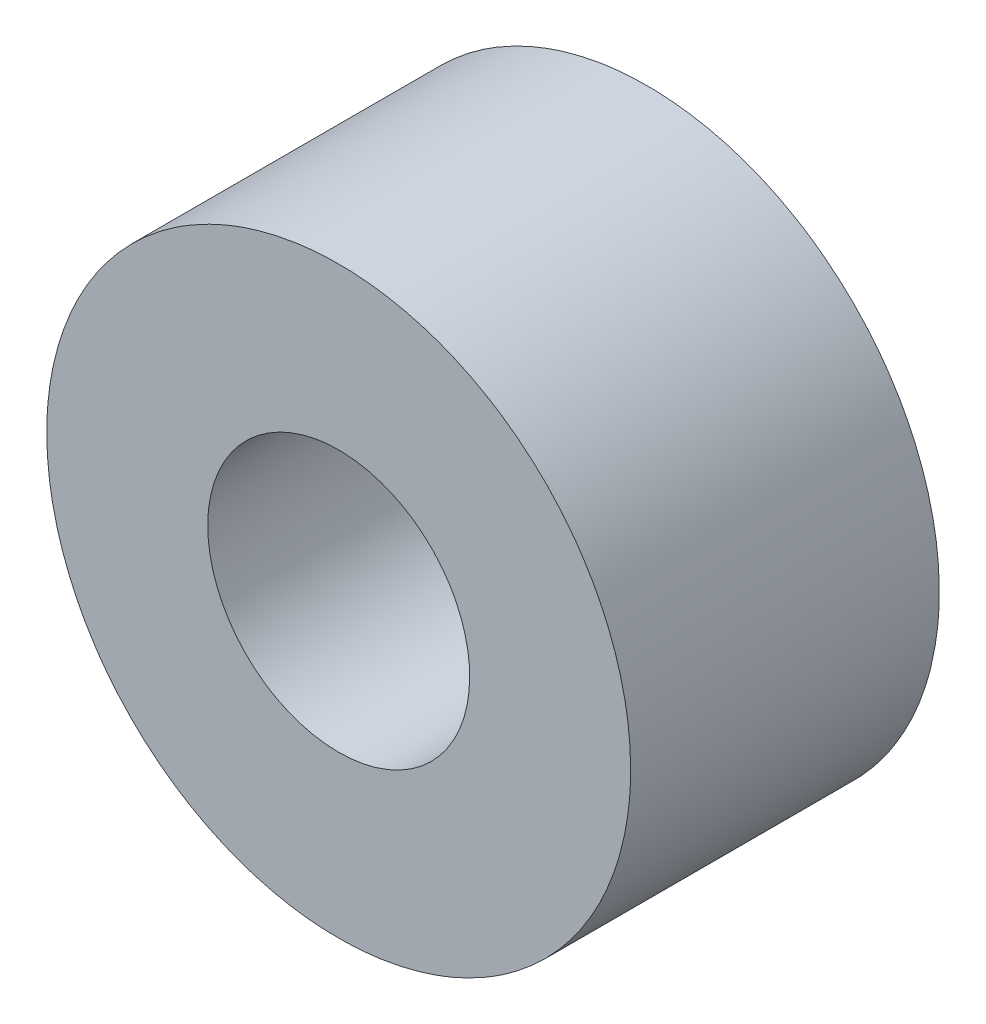
ISO-10303-21;
HEADER;
FILE_DESCRIPTION(('STEP AP214'),'2;1');
FILE_NAME('part.step','',(''),(''),'','','');
FILE_SCHEMA(('AUTOMOTIVE_DESIGN { 1 0 10303 214 1 1 1 1 }'));
ENDSEC;
DATA;
#1=APPLICATION_CONTEXT('core data for automotive mechanical design processes');
#2=APPLICATION_PROTOCOL_DEFINITION('international standard','automotive_design',2000,#1);
#3=PRODUCT_CONTEXT('',#1,'mechanical');
#4=PRODUCT('Part','Part','',(#3));
#5=PRODUCT_RELATED_PRODUCT_CATEGORY('part','',(#4));
#6=PRODUCT_DEFINITION_FORMATION('','',#4);
#7=PRODUCT_DEFINITION_CONTEXT('part definition',#1,'design');
#8=PRODUCT_DEFINITION('design','',#6,#7);
#9=PRODUCT_DEFINITION_SHAPE('','',#8);
#10=(LENGTH_UNIT() NAMED_UNIT(*) SI_UNIT(.MILLI.,.METRE.));
#11=(NAMED_UNIT(*) PLANE_ANGLE_UNIT() SI_UNIT($,.RADIAN.));
#12=(NAMED_UNIT(*) SI_UNIT($,.STERADIAN.) SOLID_ANGLE_UNIT());
#13=UNCERTAINTY_MEASURE_WITH_UNIT(LENGTH_MEASURE(1.E-05),#10,'distance_accuracy_value','');
#14=(GEOMETRIC_REPRESENTATION_CONTEXT(3) GLOBAL_UNCERTAINTY_ASSIGNED_CONTEXT((#13)) GLOBAL_UNIT_ASSIGNED_CONTEXT((#10,
#11,#12)) REPRESENTATION_CONTEXT('',''));
#15=CARTESIAN_POINT('',(0.,0.,0.));
#16=DIRECTION('',(0.,0.,1.));
#17=DIRECTION('',(1.,0.,0.));
#18=AXIS2_PLACEMENT_3D('',#15,#16,#17);
#19=CARTESIAN_POINT('',(9.715,0.,31.05));
#20=CARTESIAN_POINT('',(9.715,0.,29.2));
#21=(BOUNDED_CURVE() B_SPLINE_CURVE(1,(#19,#20),.UNSPECIFIED.,.F.,
.F.) B_SPLINE_CURVE_WITH_KNOTS((2,2),(0.,1.),
.UNSPECIFIED.) CURVE() GEOMETRIC_REPRESENTATION_ITEM() RATIONAL_B_SPLINE_CURVE((1.,1.)) REPRESENTATION_ITEM(''));
#22=CARTESIAN_POINT('',(10.5,0.,30.75));
#23=DIRECTION('',(0.,0.,-1.));
#24=AXIS1_PLACEMENT('',#22,#23);
#25=SURFACE_OF_REVOLUTION('',#21,#24);
#26=CARTESIAN_POINT('',(11.285,-2.14675006004466E-10,29.2));
#27=CARTESIAN_POINT('',(11.2849963750148,0.0440684133574314,29.2));
#28=CARTESIAN_POINT('',(11.2812754640604,0.0881768203301335,29.2));
#29=CARTESIAN_POINT('',(11.2664725207291,0.17521679726765,29.2));
#30=CARTESIAN_POINT('',(11.2553747338933,0.218145643325502,29.2));
#31=CARTESIAN_POINT('',(11.2261382734314,0.301488087333988,29.2));
#32=CARTESIAN_POINT('',(11.2080072198731,0.341904352697235,29.2));
#33=CARTESIAN_POINT('',(11.1652166658533,0.419118747931632,29.2));
#34=CARTESIAN_POINT('',(11.1405570158521,0.455916794899813,29.2));
#35=CARTESIAN_POINT('',(11.085411325476,0.524849041618551,29.2));
#36=CARTESIAN_POINT('',(11.0549256027588,0.556983495476428,29.2));
#37=CARTESIAN_POINT('',(10.9889892760106,0.615680875051215,29.2));
#38=CARTESIAN_POINT('',(10.9535382446612,0.642243320744643,29.2));
#39=CARTESIAN_POINT('',(10.8786811775078,0.689038329909469,29.2));
#40=CARTESIAN_POINT('',(10.8392752909095,0.709271132062058,29.2));
#41=CARTESIAN_POINT('',(10.757626451956,0.742833653882891,29.2));
#42=CARTESIAN_POINT('',(10.7153835299072,0.756163447278492,29.2));
#43=CARTESIAN_POINT('',(10.6292591552849,0.775541948528298,29.2));
#44=CARTESIAN_POINT('',(10.5853776939624,0.781590617498208,29.2));
#45=CARTESIAN_POINT('',(10.4972221192467,0.786235033158719,29.2));
#46=CARTESIAN_POINT('',(10.4529480058536,0.78483077984932,29.2));
#47=CARTESIAN_POINT('',(10.3652641736954,0.774609244113034,29.2));
#48=CARTESIAN_POINT('',(10.3218544503154,0.765792001274523,29.2));
#49=CARTESIAN_POINT('',(10.2371309638373,0.740994690686244,29.2));
#50=CARTESIAN_POINT('',(10.1958172231305,0.725014546432774,29.2));
#51=CARTESIAN_POINT('',(10.1164574802189,0.686344343556039,29.2));
#52=CARTESIAN_POINT('',(10.0784116013136,0.663654031894831,29.2));
#53=CARTESIAN_POINT('',(10.0066725494512,0.612209984699173,29.2));
#54=CARTESIAN_POINT('',(9.97297900198056,0.583456771432166,29.2));
#55=CARTESIAN_POINT('',(9.91089540174609,0.520700669046193,29.2));
#56=CARTESIAN_POINT('',(9.88250563818064,0.486697493848114,29.2));
#57=CARTESIAN_POINT('',(9.83183851437879,0.414406851919968,29.2));
#58=CARTESIAN_POINT('',(9.80956101414177,0.376119483347099,29.2));
#59=CARTESIAN_POINT('',(9.77172903292193,0.296310493937302,29.2));
#60=CARTESIAN_POINT('',(9.75618184953922,0.254785419760728,29.2));
#61=CARTESIAN_POINT('',(9.73231495729556,0.169782736443318,29.2));
#62=CARTESIAN_POINT('',(9.72397986741072,0.126309491560882,29.2));
#63=CARTESIAN_POINT('',(9.71644842974934,0.0550869072695784,29.2));
#64=CARTESIAN_POINT('',(9.71499773367495,0.0275512696503874,29.2));
#65=CARTESIAN_POINT('',(9.71500362499988,-0.0440684136194467,29.2));
#66=CARTESIAN_POINT('',(9.71872453596904,-0.0881768205908649,29.2));
#67=CARTESIAN_POINT('',(9.73352747932935,-0.175216797523317,29.2));
#68=CARTESIAN_POINT('',(9.7446252661795,-0.218145643577392,29.2));
#69=CARTESIAN_POINT('',(9.77386172666911,-0.301488087576055,29.2));
#70=CARTESIAN_POINT('',(9.79199278024087,-0.341904352933252,29.2));
#71=CARTESIAN_POINT('',(9.83478333428643,-0.419118748153375,29.2));
#72=CARTESIAN_POINT('',(9.85944298429988,-0.455916795113334,29.2));
#73=CARTESIAN_POINT('',(9.91458867469898,-0.524849041813694,29.2));
#74=CARTESIAN_POINT('',(9.94507439742688,-0.556983495661412,29.2));
#75=CARTESIAN_POINT('',(10.0110107241946,-0.615680875214218,29.2));
#76=CARTESIAN_POINT('',(10.0464617555529,-0.642243320895826,29.2));
#77=CARTESIAN_POINT('',(10.1213188227219,-0.689038330035695,29.2));
#78=CARTESIAN_POINT('',(10.1607247093269,-0.709271132175147,29.2));
#79=CARTESIAN_POINT('',(10.2423735482916,-0.742833653968765,29.2));
#80=CARTESIAN_POINT('',(10.2846164703449,-0.756163447350286,29.2));
#81=CARTESIAN_POINT('',(10.3707408449736,-0.775541948571385,29.2));
#82=CARTESIAN_POINT('',(10.4146223062981,-0.781590617526668,29.2));
#83=CARTESIAN_POINT('',(10.5027778810153,-0.786235033157793,29.2));
#84=CARTESIAN_POINT('',(10.547051994408,-0.784830779833636,29.2));
#85=CARTESIAN_POINT('',(10.6347358265628,-0.774609244068122,29.2));
#86=CARTESIAN_POINT('',(10.6781455499399,-0.765792001215141,29.2));
#87=CARTESIAN_POINT('',(10.7628690364097,-0.740994690598622,29.2));
#88=CARTESIAN_POINT('',(10.8041827771111,-0.72501454633138,29.2));
#89=CARTESIAN_POINT('',(10.8835425200099,-0.686344343428188,29.2));
#90=CARTESIAN_POINT('',(10.9215883989076,-0.663654031754294,29.2));
#91=CARTESIAN_POINT('',(10.9933274507529,-0.612209984534721,29.2));
#92=CARTESIAN_POINT('',(11.0270209982139,-0.583456771256487,29.2));
#93=CARTESIAN_POINT('',(11.0891045984275,-0.520700668849823,29.2));
#94=CARTESIAN_POINT('',(11.1174943619816,-0.486697493642279,29.2));
#95=CARTESIAN_POINT('',(11.1681614857593,-0.414406851697233,29.2));
#96=CARTESIAN_POINT('',(11.1904389859836,-0.376119483116931,29.2));
#97=CARTESIAN_POINT('',(11.2282709671769,-0.296310493694451,29.2));
#98=CARTESIAN_POINT('',(11.2438181505458,-0.254785419512619,29.2));
#99=CARTESIAN_POINT('',(11.2676850427611,-0.169782736187119,29.2));
#100=CARTESIAN_POINT('',(11.2760201326314,-0.126309491301858,29.2));
#101=CARTESIAN_POINT('',(11.2835515702507,-0.0550869071818871,29.2));
#102=CARTESIAN_POINT('',(11.2850022663159,-0.0275512697375952,29.2));
#103=CARTESIAN_POINT('',(11.285,-2.14675006004466E-10,29.2));
#104=B_SPLINE_CURVE_WITH_KNOTS('',3,(#26,#27,#28,#29,#30,#31,#32,#33,#34,#35,#36,#37,#38,#39,
#40,#41,#42,#43,#44,#45,#46,#47,#48,#49,#50,#51,#52,#53,#54,#55,#56,#57,#58,#59,#60,#61,#62,#63,
#64,#65,#66,#67,#68,#69,#70,#71,#72,#73,#74,#75,#76,#77,#78,#79,#80,#81,#82,#83,#84,#85,#86,#87,
#88,#89,#90,#91,#92,#93,#94,#95,#96,#97,#98,#99,#100,#101,#102,#103),.UNSPECIFIED.,.T.,.F.,(4,2,
2,2,2,2,2,2,2,2,2,2,2,2,2,2,2,2,2,2,2,2,2,2,2,2,2,2,2,2,2,2,2,2,2,2,2,2,4),(0.,0.13211887372528,
0.264520818190566,0.396779712979158,0.529041637463574,0.661296352624468,0.793562456734952,
0.925823572691311,1.05808327600806,1.19034368564462,1.32260409528119,1.45486379859794,
1.58712491455429,1.71939101866475,1.85164573382567,1.98390765831007,2.11616655309868,
2.2485684975636,2.38068737128924,2.46328718433094,2.59540605805659,2.72780800252151,
2.86006689731012,2.99232882179452,3.12458353695543,3.2568496410659,3.38911075702225,
3.521370460339,3.65363086997557,3.78589127961213,3.91815098292888,4.05041209888524,
4.18267820299572,4.31493291815661,4.44719484264103,4.57945373742962,4.71185568189491,
4.84397455562019,4.92657436813928),.UNSPECIFIED.);
#105=CARTESIAN_POINT('',(11.285,-2.14675006004466E-10,29.2));
#106=VERTEX_POINT('',#105);
#107=EDGE_CURVE('E20',#106,#106,#104,.T.);
#108=ORIENTED_EDGE('',*,*,#107,.F.);
#109=EDGE_LOOP('',(#108));
#110=FACE_BOUND('',#109,.T.);
#111=CARTESIAN_POINT('',(11.285,-2.14675006004466E-10,31.05));
#112=CARTESIAN_POINT('',(11.2849963749907,-0.0440684137871295,31.05));
#113=CARTESIAN_POINT('',(11.2812754640121,-0.0881768207577528,31.05));
#114=CARTESIAN_POINT('',(11.2664725206332,-0.175216797687043,31.05));
#115=CARTESIAN_POINT('',(11.2553747337739,-0.218145643738747,31.05));
#116=CARTESIAN_POINT('',(11.2261382732665,-0.301488087731165,31.05));
#117=CARTESIAN_POINT('',(11.2080072196861,-0.34190435308449,31.05));
#118=CARTESIAN_POINT('',(11.165216665624,-0.419118748295472,31.05));
#119=CARTESIAN_POINT('',(11.1405570156027,-0.455916795250163,31.05));
#120=CARTESIAN_POINT('',(11.0854113251889,-0.524849041938743,31.05));
#121=CARTESIAN_POINT('',(11.0549256024541,-0.55698349577995,31.05));
#122=CARTESIAN_POINT('',(10.9889892756739,-0.615680875318672,31.05));
#123=CARTESIAN_POINT('',(10.9535382443099,-0.642243320992706,31.05));
#124=CARTESIAN_POINT('',(10.8786811771309,-0.689038330116585,31.05));
#125=CARTESIAN_POINT('',(10.8392752905216,-0.70927113224762,31.05));
#126=CARTESIAN_POINT('',(10.7576264515498,-0.742833654023797,31.05));
#127=CARTESIAN_POINT('',(10.7153835294936,-0.756163447396294,31.05));
#128=CARTESIAN_POINT('',(10.6292591548608,-0.775541948598996,31.05));
#129=CARTESIAN_POINT('',(10.5853776935349,-0.781590617544905,31.05));
#130=CARTESIAN_POINT('',(10.4972221188167,-0.7862350331572,31.05));
#131=CARTESIAN_POINT('',(10.4529480054243,-0.784830779823585,31.05));
#132=CARTESIAN_POINT('',(10.3652641732717,-0.774609244039342,31.05));
#133=CARTESIAN_POINT('',(10.3218544498966,-0.765792001177088,31.05));
#134=CARTESIAN_POINT('',(10.237130963432,-0.740994690542471,31.05));
#135=CARTESIAN_POINT('',(10.195817222734,-0.725014546266404,31.05));
#136=CARTESIAN_POINT('',(10.1164574798435,-0.68634434334626,31.05));
#137=CARTESIAN_POINT('',(10.0784116009506,-0.663654031664239,31.05));
#138=CARTESIAN_POINT('',(10.0066725491163,-0.612209984429341,31.05));
#139=CARTESIAN_POINT('',(9.97297900166143,-0.583456771143909,31.05));
#140=CARTESIAN_POINT('',(9.91089540146129,-0.520700668723984,31.05));
#141=CARTESIAN_POINT('',(9.88250563791444,-0.486697493510376,31.05));
#142=CARTESIAN_POINT('',(9.83183851415213,-0.414406851554508,31.05));
#143=CARTESIAN_POINT('',(9.80956101393605,-0.376119482969447,31.05));
#144=CARTESIAN_POINT('',(9.77172903275981,-0.296310493538885,31.05));
#145=CARTESIAN_POINT('',(9.75618184939978,-0.254785419353733,31.05));
#146=CARTESIAN_POINT('',(9.73231495720265,-0.169782736023136,31.05));
#147=CARTESIAN_POINT('',(9.72397986734161,-0.126309491136093,31.05));
#148=CARTESIAN_POINT('',(9.71644842973754,-0.0550869070145134,31.05));
#149=CARTESIAN_POINT('',(9.71499773367825,-0.0275512695699114,31.05));
#150=CARTESIAN_POINT('',(9.71500362499462,0.0440684135251144,31.05));
#151=CARTESIAN_POINT('',(9.71872453595847,0.0881768204970218,31.05));
#152=CARTESIAN_POINT('',(9.7335274793083,0.175216797431376,31.05));
#153=CARTESIAN_POINT('',(9.74462526615334,0.218145643486857,31.05));
#154=CARTESIAN_POINT('',(9.77386172663301,0.301488087489098,31.05));
#155=CARTESIAN_POINT('',(9.79199278019994,0.341904352848473,31.05));
#156=CARTESIAN_POINT('',(9.83478333423625,0.419118748073729,31.05));
#157=CARTESIAN_POINT('',(9.8594429842453,0.455916795036642,31.05));
#158=CARTESIAN_POINT('',(9.91458867463614,0.524849041743601,31.05));
#159=CARTESIAN_POINT('',(9.94507439736019,0.556983495594966,31.05));
#160=CARTESIAN_POINT('',(10.0110107241209,0.615680875155669,31.05));
#161=CARTESIAN_POINT('',(10.046461755476,0.642243320841524,31.05));
#162=CARTESIAN_POINT('',(10.1213188226394,0.689038329990359,31.05));
#163=CARTESIAN_POINT('',(10.160724709242,0.70927113213453,31.05));
#164=CARTESIAN_POINT('',(10.2423735482026,0.742833653937922,31.05));
#165=CARTESIAN_POINT('',(10.2846164702544,0.7561634473245,31.05));
#166=CARTESIAN_POINT('',(10.3707408448807,0.77554194855591,31.05));
#167=CARTESIAN_POINT('',(10.4146223062045,0.781590617516446,31.05));
#168=CARTESIAN_POINT('',(10.5027778809212,0.786235033158126,31.05));
#169=CARTESIAN_POINT('',(10.5470519943141,0.784830779839269,31.05));
#170=CARTESIAN_POINT('',(10.6347358264701,0.774609244084253,31.05));
#171=CARTESIAN_POINT('',(10.6781455498482,0.765792001236469,31.05));
#172=CARTESIAN_POINT('',(10.762869036321,0.740994690630093,31.05));
#173=CARTESIAN_POINT('',(10.8041827770243,0.725014546367797,31.05));
#174=CARTESIAN_POINT('',(10.8835425199277,0.68634434347411,31.05));
#175=CARTESIAN_POINT('',(10.9215883988281,0.663654031804776,31.05));
#176=CARTESIAN_POINT('',(10.9933274506796,0.612209984593793,31.05));
#177=CARTESIAN_POINT('',(11.0270209981441,0.583456771319589,31.05));
#178=CARTESIAN_POINT('',(11.0891045983651,0.520700668920355,31.05));
#179=CARTESIAN_POINT('',(11.1174943619233,0.486697493716211,31.05));
#180=CARTESIAN_POINT('',(11.1681614857097,0.414406851777243,31.05));
#181=CARTESIAN_POINT('',(11.1904389859386,0.376119483199615,31.05));
#182=CARTESIAN_POINT('',(11.2282709671414,0.296310493781737,31.05));
#183=CARTESIAN_POINT('',(11.2438181505152,0.254785419601841,31.05));
#184=CARTESIAN_POINT('',(11.2676850427407,0.169782736279332,31.05));
#185=CARTESIAN_POINT('',(11.2760201326163,0.126309491395116,31.05));
#186=CARTESIAN_POINT('',(11.2835515702624,0.0550869071022035,31.05));
#187=CARTESIAN_POINT('',(11.2850022663309,0.027551269482703,31.05));
#188=CARTESIAN_POINT('',(11.285,-2.14675006004466E-10,31.05));
#189=B_SPLINE_CURVE_WITH_KNOTS('',3,(#111,#112,#113,#114,#115,#116,#117,#118,#119,#120,#121,
#122,#123,#124,#125,#126,#127,#128,#129,#130,#131,#132,#133,#134,#135,#136,#137,#138,#139,#140,
#141,#142,#143,#144,#145,#146,#147,#148,#149,#150,#151,#152,#153,#154,#155,#156,#157,#158,#159,
#160,#161,#162,#163,#164,#165,#166,#167,#168,#169,#170,#171,#172,#173,#174,#175,#176,#177,#178,
#179,#180,#181,#182,#183,#184,#185,#186,#187,#188),.UNSPECIFIED.,.T.,.F.,(4,2,2,2,2,2,2,2,2,2,2,
2,2,2,2,2,2,2,2,2,2,2,2,2,2,2,2,2,2,2,2,2,2,2,2,2,2,2,4),(0.,0.132118873725646,
0.264520818190567,0.396779712979175,0.529041637463573,0.661296352624489,0.793562456734953,
0.925823572691305,1.05808327600806,1.19034368564462,1.32260409528119,1.45486379859793,
1.58712491455429,1.71939101866478,1.85164573382567,1.98390765831008,2.11616655309868,
2.24856849756396,2.38068737128924,2.46328718380834,2.59540605753362,2.7278080019989,
2.86006689678749,2.99232882127191,3.12458353643281,3.25684964054329,3.38911075649965,
3.52137045981639,3.65363086945296,3.78589127908952,3.91815098240627,4.05041209836263,
4.18267820247309,4.314932917634,4.4471948421184,4.57945373690701,4.71185568137193,
4.84397455509758,4.92657436813928),.UNSPECIFIED.);
#190=CARTESIAN_POINT('',(11.285,-2.14675006004466E-10,31.05));
#191=VERTEX_POINT('',#190);
#192=EDGE_CURVE('E38',#191,#191,#189,.T.);
#193=ORIENTED_EDGE('',*,*,#192,.F.);
#194=EDGE_LOOP('',(#193));
#195=FACE_BOUND('',#194,.T.);
#196=ADVANCED_FACE('F15',(#110,#195),#25,.F.);
#197=CARTESIAN_POINT('',(12.271,-1.771,29.2));
#198=DIRECTION('',(0.,0.,-1.));
#199=DIRECTION('',(-1.,0.,0.));
#200=AXIS2_PLACEMENT_3D('',#197,#198,#199);
#201=PLANE('',#200);
#202=ORIENTED_EDGE('',*,*,#107,.T.);
#203=EDGE_LOOP('',(#202));
#204=FACE_BOUND('',#203,.T.);
#205=CARTESIAN_POINT('',(8.75,-1.04757964605541E-10,29.2));
#206=CARTESIAN_POINT('',(8.75000556150872,0.0982251493866591,29.2));
#207=CARTESIAN_POINT('',(8.75831538324223,0.196625111828517,29.2));
#208=CARTESIAN_POINT('',(8.78304227160514,0.342046433310846,29.2));
#209=CARTESIAN_POINT('',(8.79334982263398,0.390218732738865,29.2));
#210=CARTESIAN_POINT('',(8.81799385086424,0.485571366680833,29.2));
#211=CARTESIAN_POINT('',(8.83233359756445,0.53275086267489,29.2));
#212=CARTESIAN_POINT('',(8.88120386563321,0.672055924372216,29.2));
#213=CARTESIAN_POINT('',(8.92162555384482,0.762182537286139,29.2));
#214=CARTESIAN_POINT('',(9.01704586666338,0.934363167476646,29.2));
#215=CARTESIAN_POINT('',(9.07204504540153,1.01641687771698,29.2));
#216=CARTESIAN_POINT('',(9.16423240780247,1.13166050918512,29.2));
#217=CARTESIAN_POINT('',(9.19660063591562,1.1687906077339,29.2));
#218=CARTESIAN_POINT('',(9.2643135120048,1.24016000131911,29.2));
#219=CARTESIAN_POINT('',(9.29965526017473,1.2744020490099,29.2));
#220=CARTESIAN_POINT('',(9.40985825187803,1.37249636949064,29.2));
#221=CARTESIAN_POINT('',(9.48891722307301,1.43174174730989,29.2));
#222=CARTESIAN_POINT('',(9.65581654940892,1.53608358852925,29.2));
#223=CARTESIAN_POINT('',(9.7436565732649,1.58118058544338,29.2));
#224=CARTESIAN_POINT('',(9.92567075227811,1.65599568927143,29.2));
#225=CARTESIAN_POINT('',(10.0198448397724,1.68571396043732,29.2));
#226=CARTESIAN_POINT('',(10.2118434423801,1.72891590299424,29.2));
#227=CARTESIAN_POINT('',(10.3096679769855,1.74239948768516,29.2));
#228=CARTESIAN_POINT('',(10.5061923127853,1.75275323674859,29.2));
#229=CARTESIAN_POINT('',(10.6048921139797,1.74962340112111,29.2));
#230=CARTESIAN_POINT('',(10.8003673591014,1.72683525094113,29.2));
#231=CARTESIAN_POINT('',(10.8971428133025,1.70717702465693,29.2));
#232=CARTESIAN_POINT('',(11.0860107227109,1.65190158781217,29.2));
#233=CARTESIAN_POINT('',(11.1781031278888,1.61628420679909,29.2));
#234=CARTESIAN_POINT('',(11.3550424389926,1.5300572670034,29.2));
#235=CARTESIAN_POINT('',(11.4398890715275,1.47944714284984,29.2));
#236=CARTESIAN_POINT('',(11.5597894431405,1.39347565933346,29.2));
#237=CARTESIAN_POINT('',(11.5985335931075,1.36313677607941,29.2));
#238=CARTESIAN_POINT('',(11.6733708962474,1.29927754035163,29.2));
#239=CARTESIAN_POINT('',(11.7094614549078,1.26575414575916,29.2));
#240=CARTESIAN_POINT('',(11.8132479276225,1.16083526060566,29.2));
#241=CARTESIAN_POINT('',(11.8765645908287,1.08501493888048,29.2));
#242=CARTESIAN_POINT('',(11.9895488836619,0.923813961575196,29.2));
#243=CARTESIAN_POINT('',(12.03921703209,0.838433669558054,29.2));
#244=CARTESIAN_POINT('',(12.1024545119551,0.705034927225565,29.2));
#245=CARTESIAN_POINT('',(12.1216723533888,0.659623389613473,29.2));
#246=CARTESIAN_POINT('',(12.1561993199284,0.56738813871334,29.2));
#247=CARTESIAN_POINT('',(12.1715116083242,0.520565602852234,29.2));
#248=CARTESIAN_POINT('',(12.2113820420128,0.37854754672105,29.2));
#249=CARTESIAN_POINT('',(12.2299854307402,0.281565488206763,29.2));
#250=CARTESIAN_POINT('',(12.2435413810697,0.153339428008074,29.2));
#251=CARTESIAN_POINT('',(12.2459612727194,0.122725841638346,29.2));
#252=CARTESIAN_POINT('',(12.2491914517451,0.0614138680083485,29.2));
#253=CARTESIAN_POINT('',(12.250001739121,0.030715480748079,29.2));
#254=CARTESIAN_POINT('',(12.2499944384585,-0.0982251499705324,29.2));
#255=CARTESIAN_POINT('',(12.2416846166922,-0.196625112409673,29.2));
#256=CARTESIAN_POINT('',(12.2169577282807,-0.342046433883797,29.2));
#257=CARTESIAN_POINT('',(12.2066501772358,-0.390218733308249,29.2));
#258=CARTESIAN_POINT('',(12.1820061489738,-0.485571367241746,29.2));
#259=CARTESIAN_POINT('',(12.1676664022579,-0.532750863230898,29.2));
#260=CARTESIAN_POINT('',(12.1187961341428,-0.672055924911815,29.2));
#261=CARTESIAN_POINT('',(12.0783744459011,-0.762182537812273,29.2));
#262=CARTESIAN_POINT('',(11.9829541330252,-0.934363167970975,29.2));
#263=CARTESIAN_POINT('',(11.9279549542597,-1.01641687819297,29.2));
#264=CARTESIAN_POINT('',(11.8357675918203,-1.13166050963038,29.2));
#265=CARTESIAN_POINT('',(11.8033993636948,-1.16879060816838,29.2));
#266=CARTESIAN_POINT('',(11.7356864875818,-1.24016000173103,29.2));
#267=CARTESIAN_POINT('',(11.7003447394004,-1.27440204941004,29.2));
#268=CARTESIAN_POINT('',(11.5901417476645,-1.37249636985404,29.2));
#269=CARTESIAN_POINT('',(11.5110827764497,-1.43174174764693,29.2));
#270=CARTESIAN_POINT('',(11.3441834500791,-1.53608358881064,29.2));
#271=CARTESIAN_POINT('',(11.2563434262081,-1.58118058569549,29.2));
#272=CARTESIAN_POINT('',(11.0743292471699,-1.65599568946287,29.2));
#273=CARTESIAN_POINT('',(10.9801551596657,-1.68571396059737,29.2));
#274=CARTESIAN_POINT('',(10.7881565570436,-1.7289159030903,29.2));
#275=CARTESIAN_POINT('',(10.6903320224337,-1.7423994877486,29.2));
#276=CARTESIAN_POINT('',(10.4938076866305,-1.75275323674653,29.2));
#277=CARTESIAN_POINT('',(10.3951078854371,-1.74962340108615,29.2));
#278=CARTESIAN_POINT('',(10.199632640323,-1.726835250841,29.2));
#279=CARTESIAN_POINT('',(10.1028571861284,-1.70717702452455,29.2));
#280=CARTESIAN_POINT('',(9.91398927673852,-1.65190158761683,29.2));
#281=CARTESIAN_POINT('',(9.82189687157243,-1.61628420657306,29.2));
#282=CARTESIAN_POINT('',(9.64495756049735,-1.53005726671838,29.2));
#283=CARTESIAN_POINT('',(9.5601109279793,-1.47944714253653,29.2));
#284=CARTESIAN_POINT('',(9.440210556395,-1.39347565898017,29.2));
#285=CARTESIAN_POINT('',(9.40146640643815,-1.36313677571322,29.2));
#286=CARTESIAN_POINT('',(9.32662910331952,-1.2992775399605,29.2));
#287=CARTESIAN_POINT('',(9.29053854467023,-1.26575414535601,29.2));
#288=CARTESIAN_POINT('',(9.18675207199054,-1.16083526016791,29.2));
#289=CARTESIAN_POINT('',(9.12343540880963,-1.08501493842161,29.2));
#290=CARTESIAN_POINT('',(9.01045111603018,-0.923813961078672,29.2));
#291=CARTESIAN_POINT('',(8.96078296763048,-0.838433669044982,29.2));
#292=CARTESIAN_POINT('',(8.89754548780985,-0.7050349266913,29.2));
#293=CARTESIAN_POINT('',(8.87832764639121,-0.65962338907268,29.2));
#294=CARTESIAN_POINT('',(8.84380067988233,-0.567388138160789,29.2));
#295=CARTESIAN_POINT('',(8.82848839150207,-0.52056560229445,29.2));
#296=CARTESIAN_POINT('',(8.78861795786094,-0.378547546150004,29.2));
#297=CARTESIAN_POINT('',(8.77001456916586,-0.281565487629566,29.2));
#298=CARTESIAN_POINT('',(8.75645861889967,-0.153339427620372,29.2));
#299=CARTESIAN_POINT('',(8.75403872727039,-0.122725841444227,29.2));
#300=CARTESIAN_POINT('',(8.75080854826517,-0.061413868202469,29.2));
#301=CARTESIAN_POINT('',(8.74999826088923,-0.0307154811368567,29.2));
#302=CARTESIAN_POINT('',(8.75,-1.04757964605541E-10,29.2));
#303=B_SPLINE_CURVE_WITH_KNOTS('',3,(#205,#206,#207,#208,#209,#210,#211,#212,#213,#214,#215,
#216,#217,#218,#219,#220,#221,#222,#223,#224,#225,#226,#227,#228,#229,#230,#231,#232,#233,#234,
#235,#236,#237,#238,#239,#240,#241,#242,#243,#244,#245,#246,#247,#248,#249,#250,#251,#252,#253,
#254,#255,#256,#257,#258,#259,#260,#261,#262,#263,#264,#265,#266,#267,#268,#269,#270,#271,#272,
#273,#274,#275,#276,#277,#278,#279,#280,#281,#282,#283,#284,#285,#286,#287,#288,#289,#290,#291,
#292,#293,#294,#295,#296,#297,#298,#299,#300,#301,#302),.UNSPECIFIED.,.T.,.F.,(4,2,2,2,2,2,2,2,
2,2,2,2,2,2,2,2,2,2,2,2,2,2,2,2,2,2,2,2,2,2,2,2,2,2,2,2,2,2,2,2,2,2,2,2,2,2,2,2,4),(0.,
0.294532521043618,0.442185879987342,0.589959310361112,0.884801752624013,1.17965540428134,
1.3272754143277,1.47475309645051,1.76961383809808,2.06446345965684,2.35930993201902,
2.65415797897951,2.94900602594001,3.24385249830219,3.53870211986094,3.83356286150847,
3.98104054363131,4.12866055367768,4.42351420533499,4.71835664759791,4.86613007797131,
5.01378343691459,5.30831595795902,5.40041770753712,5.49251945711521,5.78705197815965,
5.93470533710293,6.08247876747632,6.37732120973924,6.67217486139656,6.81979487144293,
6.96727255356577,7.2621332952133,7.55698291677205,7.85182938913423,8.14667743609473,
8.44152548305522,8.73637195541739,9.03122157697615,9.32608231862373,9.47356000074654,
9.62118001079289,9.91603366245022,10.2108761047131,10.3586495350869,10.5063028940306,
10.8008354150742,10.8929371640692,10.9850389130642),.UNSPECIFIED.);
#304=CARTESIAN_POINT('',(8.75,-1.04757964605541E-10,29.2));
#305=VERTEX_POINT('',#304);
#306=EDGE_CURVE('E29',#305,#305,#303,.T.);
#307=ORIENTED_EDGE('',*,*,#306,.T.);
#308=EDGE_LOOP('',(#307));
#309=FACE_BOUND('',#308,.T.);
#310=ADVANCED_FACE('F65',(#204,#309),#201,.T.);
#311=CARTESIAN_POINT('',(8.729,-1.771,31.05));
#312=DIRECTION('',(0.,0.,1.));
#313=DIRECTION('',(1.,0.,0.));
#314=AXIS2_PLACEMENT_3D('',#311,#312,#313);
#315=PLANE('',#314);
#316=ORIENTED_EDGE('',*,*,#192,.T.);
#317=EDGE_LOOP('',(#316));
#318=FACE_BOUND('',#317,.T.);
#319=CARTESIAN_POINT('',(12.25,-4.78574854150082E-10,31.05));
#320=CARTESIAN_POINT('',(12.2499944385123,0.0982251490128433,31.05));
#321=CARTESIAN_POINT('',(12.2416846167998,0.196625111456476,31.05));
#322=CARTESIAN_POINT('',(12.2169577284679,0.342046432944087,31.05));
#323=CARTESIAN_POINT('',(12.2066501774494,0.390218732374307,31.05));
#324=CARTESIAN_POINT('',(12.1820061492395,0.485571366321539,31.05));
#325=CARTESIAN_POINT('',(12.1676664025494,0.53275086231866,31.05));
#326=CARTESIAN_POINT('',(12.1187961345104,0.672055924026425,31.05));
#327=CARTESIAN_POINT('',(12.078374446318,0.762182536948983,31.05));
#328=CARTESIAN_POINT('',(11.9829541335362,0.934363167159872,31.05));
#329=CARTESIAN_POINT('',(11.9279549548156,1.01641687741196,31.05));
#330=CARTESIAN_POINT('',(11.8357675924393,1.13166050889979,31.05));
#331=CARTESIAN_POINT('',(11.803399364334,1.16879060745548,31.05));
#332=CARTESIAN_POINT('',(11.7356864882601,1.24016000105516,31.05));
#333=CARTESIAN_POINT('',(11.7003447400975,1.27440204875349,31.05));
#334=CARTESIAN_POINT('',(11.5901417484152,1.37249636925778,31.05));
#335=CARTESIAN_POINT('',(11.5110827772328,1.43174174709392,31.05));
#336=CARTESIAN_POINT('',(11.3441834509192,1.53608358834893,31.05));
#337=CARTESIAN_POINT('',(11.2563434270729,1.58118058528182,31.05));
#338=CARTESIAN_POINT('',(11.0743292480756,1.65599568914875,31.05));
#339=CARTESIAN_POINT('',(10.9801551605876,1.68571396033476,31.05));
#340=CARTESIAN_POINT('',(10.7881565579892,1.72891590293269,31.05));
#341=CARTESIAN_POINT('',(10.6903320233867,1.7423994876445,31.05));
#342=CARTESIAN_POINT('',(10.4938076875891,1.75275323674992,31.05));
#343=CARTESIAN_POINT('',(10.395107886394,1.74962340114352,31.05));
#344=CARTESIAN_POINT('',(10.1996326412675,1.72683525100529,31.05));
#345=CARTESIAN_POINT('',(10.1028571870621,1.70717702474177,31.05));
#346=CARTESIAN_POINT('',(9.91398927764201,1.65190158793735,31.05));
#347=CARTESIAN_POINT('',(9.82189687245644,1.61628420694394,31.05));
#348=CARTESIAN_POINT('',(9.64495756133422,1.53005726718605,31.05));
#349=CARTESIAN_POINT('',(9.5601109287885,1.47944714305061,31.05));
#350=CARTESIAN_POINT('',(9.44021055715718,1.39347565955984,31.05));
#351=CARTESIAN_POINT('',(9.40146640718373,1.36313677631407,31.05));
#352=CARTESIAN_POINT('',(9.32662910403016,1.29927754060228,31.05));
#353=CARTESIAN_POINT('',(9.29053854536253,1.26575414601752,31.05));
#354=CARTESIAN_POINT('',(9.18675207262545,1.16083526088619,31.05));
#355=CARTESIAN_POINT('',(9.12343540940308,1.08501493917452,31.05));
#356=CARTESIAN_POINT('',(9.01045111653546,0.92381396189338,31.05));
#357=CARTESIAN_POINT('',(8.96078296808906,0.838433669886846,31.05));
#358=CARTESIAN_POINT('',(8.89754548819552,0.705034927567866,31.05));
#359=CARTESIAN_POINT('',(8.87832764675208,0.659623389959879,31.05));
#360=CARTESIAN_POINT('',(8.84380068019283,0.567388139067121,31.05));
#361=CARTESIAN_POINT('',(8.82848839178699,0.520565603209285,31.05));
#362=CARTESIAN_POINT('',(8.7886179580681,0.378547547086618,31.05));
#363=CARTESIAN_POINT('',(8.77001456931994,0.281565488576306,31.05));
#364=CARTESIAN_POINT('',(8.75645861896308,0.153339428380512,31.05));
#365=CARTESIAN_POINT('',(8.75403872730683,0.122725842011301,31.05));
#366=CARTESIAN_POINT('',(8.75080854826806,0.0614138683819931,31.05));
#367=CARTESIAN_POINT('',(8.74999826088553,0.0307154811218965,31.05));
#368=CARTESIAN_POINT('',(8.7500055615205,-0.098225149596717,31.05));
#369=CARTESIAN_POINT('',(8.75831538326582,-0.196625112037633,31.05));
#370=CARTESIAN_POINT('',(8.78304227164622,-0.342046433517039,31.05));
#371=CARTESIAN_POINT('',(8.79334982268082,-0.390218732943692,31.05));
#372=CARTESIAN_POINT('',(8.81799385092244,-0.485571366882454,31.05));
#373=CARTESIAN_POINT('',(8.83233359762827,-0.532750862874669,31.05));
#374=CARTESIAN_POINT('',(8.88120386571367,-0.672055924566025,31.05));
#375=CARTESIAN_POINT('',(8.92162555393608,-0.762182537475117,31.05));
#376=CARTESIAN_POINT('',(9.01704586677525,-0.934363167654201,31.05));
#377=CARTESIAN_POINT('',(9.07204504552323,-1.01641687788795,31.05));
#378=CARTESIAN_POINT('',(9.16423240793796,-1.13166050934505,31.05));
#379=CARTESIAN_POINT('',(9.19660063605556,-1.16879060788996,31.05));
#380=CARTESIAN_POINT('',(9.2643135121533,-1.24016000146707,31.05));
#381=CARTESIAN_POINT('',(9.29965526032733,-1.27440204915363,31.05));
#382=CARTESIAN_POINT('',(9.40985825204237,-1.37249636962118,31.05));
#383=CARTESIAN_POINT('',(9.48891722324444,-1.43174174743095,31.05));
#384=CARTESIAN_POINT('',(9.65581654959282,-1.53608358863032,31.05));
#385=CARTESIAN_POINT('',(9.7436565734542,-1.58118058553393,31.05));
#386=CARTESIAN_POINT('',(9.92567075247636,-1.65599568934019,31.05));
#387=CARTESIAN_POINT('',(10.0198448399743,-1.6857139604948,31.05));
#388=CARTESIAN_POINT('',(10.2118434425871,-1.72891590302874,31.05));
#389=CARTESIAN_POINT('',(10.3096679771941,-1.74239948770795,31.05));
#390=CARTESIAN_POINT('',(10.5061923129951,-1.75275323674785,31.05));
#391=CARTESIAN_POINT('',(10.6048921141892,-1.74962340110856,31.05));
#392=CARTESIAN_POINT('',(10.8003673593081,-1.72683525090516,31.05));
#393=CARTESIAN_POINT('',(10.8971428135069,-1.70717702460939,31.05));
#394=CARTESIAN_POINT('',(11.0860107229086,-1.65190158774201,31.05));
#395=CARTESIAN_POINT('',(11.1781031280823,-1.61628420671791,31.05));
#396=CARTESIAN_POINT('',(11.3550424391758,-1.53005726690103,31.05));
#397=CARTESIAN_POINT('',(11.4398890717047,-1.4794471427373,31.05));
#398=CARTESIAN_POINT('',(11.5597894433073,-1.39347565920655,31.05));
#399=CARTESIAN_POINT('',(11.5985335932707,-1.36313677594787,31.05));
#400=CARTESIAN_POINT('',(11.6733708964029,-1.29927754021115,31.05));
#401=CARTESIAN_POINT('',(11.7094614550594,-1.26575414561436,31.05));
#402=CARTESIAN_POINT('',(11.8132479277615,-1.16083526044843,31.05));
#403=CARTESIAN_POINT('',(11.8765645909586,-1.08501493871566,31.05));
#404=CARTESIAN_POINT('',(11.9895488837725,-0.923813961396855,31.05));
#405=CARTESIAN_POINT('',(12.0392170321904,-0.838433669373774,31.05));
#406=CARTESIAN_POINT('',(12.1024545120395,-0.7050349270336,31.05));
#407=CARTESIAN_POINT('',(12.1216723534679,-0.659623389419085,31.05));
#408=CARTESIAN_POINT('',(12.1561993199965,-0.56738813851457,31.05));
#409=CARTESIAN_POINT('',(12.1715116083867,-0.520565602651501,31.05));
#410=CARTESIAN_POINT('',(12.2113820420582,-0.378547546515572,31.05));
#411=CARTESIAN_POINT('',(12.229985430774,-0.281565487999108,31.05));
#412=CARTESIAN_POINT('',(12.2435413810676,-0.15333942799281,31.05));
#413=CARTESIAN_POINT('',(12.2459612727034,-0.122725841817182,31.05));
#414=CARTESIAN_POINT('',(12.2491914517217,-0.0614138685761135,31.05));
#415=CARTESIAN_POINT('',(12.2500017391042,-0.0307154815106742,31.05));
#416=CARTESIAN_POINT('',(12.25,-4.78574854150082E-10,31.05));
#417=B_SPLINE_CURVE_WITH_KNOTS('',3,(#319,#320,#321,#322,#323,#324,#325,#326,#327,#328,#329,
#330,#331,#332,#333,#334,#335,#336,#337,#338,#339,#340,#341,#342,#343,#344,#345,#346,#347,#348,
#349,#350,#351,#352,#353,#354,#355,#356,#357,#358,#359,#360,#361,#362,#363,#364,#365,#366,#367,
#368,#369,#370,#371,#372,#373,#374,#375,#376,#377,#378,#379,#380,#381,#382,#383,#384,#385,#386,
#387,#388,#389,#390,#391,#392,#393,#394,#395,#396,#397,#398,#399,#400,#401,#402,#403,#404,#405,
#406,#407,#408,#409,#410,#411,#412,#413,#414,#415,#416),.UNSPECIFIED.,.T.,.F.,(4,2,2,2,2,2,2,2,
2,2,2,2,2,2,2,2,2,2,2,2,2,2,2,2,2,2,2,2,2,2,2,2,2,2,2,2,2,2,2,2,2,2,2,2,2,2,2,2,4),(0.,
0.294532521043618,0.442185879987341,0.589959310361112,0.884801752624013,1.17965540428134,
1.3272754143277,1.47475309645051,1.76961383809809,2.06446345965685,2.35930993201902,
2.65415797897951,2.94900602594001,3.24385249830219,3.53870211986094,3.83356286150847,
3.9810405436313,4.12866055367768,4.42351420533499,4.71835664759791,4.86613007797131,
5.01378343691459,5.30831595795902,5.40041770753712,5.49251945711521,5.78705197815965,
5.93470533710293,6.08247876747632,6.37732120973924,6.67217486139655,6.81979487144293,
6.96727255356577,7.2621332952133,7.55698291677205,7.85182938913423,8.14667743609472,
8.44152548305522,8.73637195541739,9.03122157697615,9.32608231862372,9.47356000074654,
9.62118001079289,9.91603366245022,10.2108761047131,10.3586495350869,10.5063028940306,
10.8008354150742,10.8929371640692,10.9850389130642),.UNSPECIFIED.);
#418=CARTESIAN_POINT('',(12.25,-4.78574854150082E-10,31.05));
#419=VERTEX_POINT('',#418);
#420=EDGE_CURVE('E10',#419,#419,#417,.T.);
#421=ORIENTED_EDGE('',*,*,#420,.T.);
#422=EDGE_LOOP('',(#421));
#423=FACE_BOUND('',#422,.T.);
#424=ADVANCED_FACE('F17',(#318,#423),#315,.T.);
#425=CARTESIAN_POINT('',(8.75,0.,31.05));
#426=CARTESIAN_POINT('',(8.75,0.,29.2));
#427=(BOUNDED_CURVE() B_SPLINE_CURVE(1,(#425,#426),.UNSPECIFIED.,.F.,
.F.) B_SPLINE_CURVE_WITH_KNOTS((2,2),(0.,1.),
.UNSPECIFIED.) CURVE() GEOMETRIC_REPRESENTATION_ITEM() RATIONAL_B_SPLINE_CURVE((1.,1.)) REPRESENTATION_ITEM(''));
#428=CARTESIAN_POINT('',(10.5,0.,29.15));
#429=DIRECTION('',(0.,0.,-1.));
#430=AXIS1_PLACEMENT('',#428,#429);
#431=SURFACE_OF_REVOLUTION('',#427,#430);
#432=ORIENTED_EDGE('',*,*,#420,.F.);
#433=EDGE_LOOP('',(#432));
#434=FACE_BOUND('',#433,.T.);
#435=ORIENTED_EDGE('',*,*,#306,.F.);
#436=EDGE_LOOP('',(#435));
#437=FACE_BOUND('',#436,.T.);
#438=ADVANCED_FACE('F52',(#434,#437),#431,.T.);
#439=CLOSED_SHELL('',(#196,#310,#424,#438));
#440=MANIFOLD_SOLID_BREP('B1',#439);
#441=ADVANCED_BREP_SHAPE_REPRESENTATION('',(#18,#440),#14);
#442=SHAPE_DEFINITION_REPRESENTATION(#9,#441);
ENDSEC;
END-ISO-10303-21;
